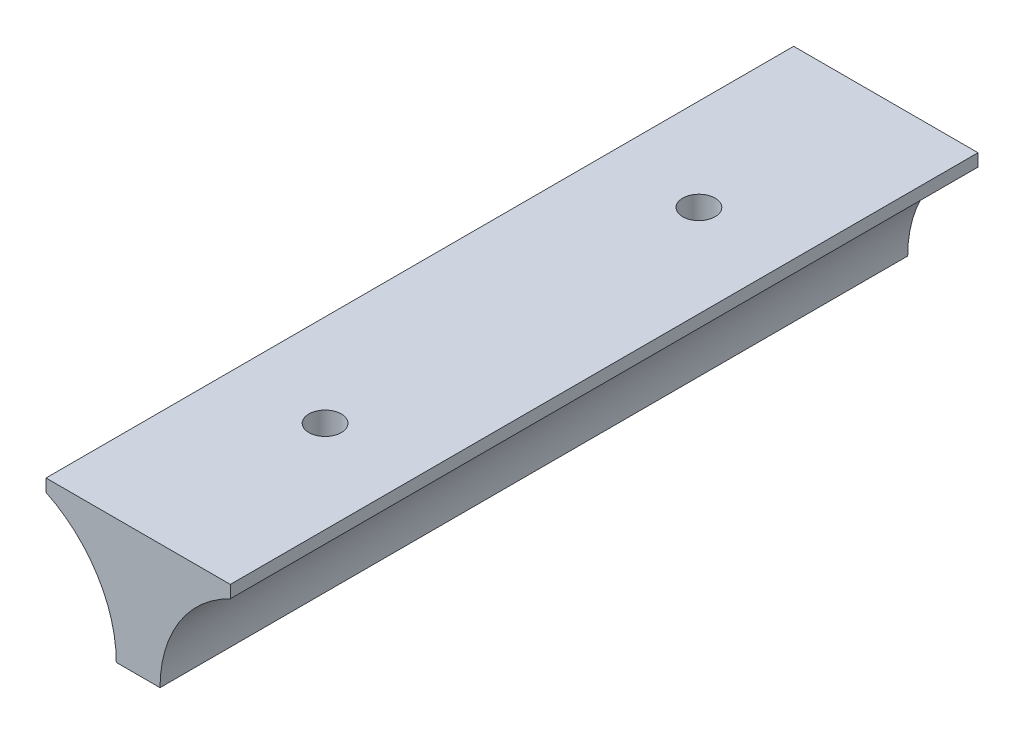
ISO-10303-21;
HEADER;
FILE_DESCRIPTION(('STEP AP214'),'2;1');
FILE_NAME('part.step','',(''),(''),'','','');
FILE_SCHEMA(('AUTOMOTIVE_DESIGN { 1 0 10303 214 1 1 1 1 }'));
ENDSEC;
DATA;
#1=APPLICATION_CONTEXT('core data for automotive mechanical design processes');
#2=APPLICATION_PROTOCOL_DEFINITION('international standard','automotive_design',2000,#1);
#3=PRODUCT_CONTEXT('',#1,'mechanical');
#4=PRODUCT('Part','Part','',(#3));
#5=PRODUCT_RELATED_PRODUCT_CATEGORY('part','',(#4));
#6=PRODUCT_DEFINITION_FORMATION('','',#4);
#7=PRODUCT_DEFINITION_CONTEXT('part definition',#1,'design');
#8=PRODUCT_DEFINITION('design','',#6,#7);
#9=PRODUCT_DEFINITION_SHAPE('','',#8);
#10=(LENGTH_UNIT() NAMED_UNIT(*) SI_UNIT(.MILLI.,.METRE.));
#11=(NAMED_UNIT(*) PLANE_ANGLE_UNIT() SI_UNIT($,.RADIAN.));
#12=(NAMED_UNIT(*) SI_UNIT($,.STERADIAN.) SOLID_ANGLE_UNIT());
#13=UNCERTAINTY_MEASURE_WITH_UNIT(LENGTH_MEASURE(1.E-05),#10,'distance_accuracy_value','');
#14=(GEOMETRIC_REPRESENTATION_CONTEXT(3) GLOBAL_UNCERTAINTY_ASSIGNED_CONTEXT((#13)) GLOBAL_UNIT_ASSIGNED_CONTEXT((#10,
#11,#12)) REPRESENTATION_CONTEXT('',''));
#15=CARTESIAN_POINT('',(0.,0.,0.));
#16=DIRECTION('',(0.,0.,1.));
#17=DIRECTION('',(1.,0.,0.));
#18=AXIS2_PLACEMENT_3D('',#15,#16,#17);
#19=CARTESIAN_POINT('',(-11.7545,0.,60.));
#20=DIRECTION('',(0.,0.,-1.));
#21=DIRECTION('',(-1.,0.,0.));
#22=AXIS2_PLACEMENT_3D('',#19,#20,#21);
#23=CYLINDRICAL_SURFACE('',#22,10.);
#24=CARTESIAN_POINT('',(-11.7545,0.,0.));
#25=DIRECTION('',(0.,0.,-1.));
#26=DIRECTION('',(1.,0.,0.));
#27=AXIS2_PLACEMENT_3D('',#24,#25,#26);
#28=CIRCLE('',#27,10.);
#29=CARTESIAN_POINT('',(-7.39560105645933,9.,0.));
#30=VERTEX_POINT('',#29);
#31=CARTESIAN_POINT('',(-1.7545,0.,0.));
#32=VERTEX_POINT('',#31);
#33=EDGE_CURVE('E121',#30,#32,#28,.T.);
#34=ORIENTED_EDGE('',*,*,#33,.T.);
#35=DIRECTION('',(0.,0.,-1.));
#36=VECTOR('',#35,1.);
#37=CARTESIAN_POINT('',(-1.7545,0.,60.));
#38=LINE('',#37,#36);
#39=CARTESIAN_POINT('',(-1.7545,0.,60.));
#40=VERTEX_POINT('',#39);
#41=EDGE_CURVE('E11',#40,#32,#38,.T.);
#42=ORIENTED_EDGE('',*,*,#41,.F.);
#43=CARTESIAN_POINT('',(-11.7545,0.,60.));
#44=DIRECTION('',(0.,0.,-1.));
#45=DIRECTION('',(1.,0.,0.));
#46=AXIS2_PLACEMENT_3D('',#43,#44,#45);
#47=CIRCLE('',#46,10.);
#48=CARTESIAN_POINT('',(-7.39560105645933,9.,60.));
#49=VERTEX_POINT('',#48);
#50=EDGE_CURVE('E132',#49,#40,#47,.T.);
#51=ORIENTED_EDGE('',*,*,#50,.F.);
#52=DIRECTION('',(0.,0.,-1.));
#53=VECTOR('',#52,1.);
#54=CARTESIAN_POINT('',(-7.39560105645933,9.,60.));
#55=LINE('',#54,#53);
#56=EDGE_CURVE('E117',#49,#30,#55,.T.);
#57=ORIENTED_EDGE('',*,*,#56,.T.);
#58=EDGE_LOOP('',(#34,#42,#51,#57));
#59=FACE_BOUND('',#58,.T.);
#60=ADVANCED_FACE('F37',(#59),#23,.F.);
#61=CARTESIAN_POINT('',(-1.7545,0.,60.));
#62=DIRECTION('',(0.,1.,0.));
#63=DIRECTION('',(-1.,0.,0.));
#64=AXIS2_PLACEMENT_3D('',#61,#62,#63);
#65=PLANE('',#64);
#66=CARTESIAN_POINT('',(0.,0.,45.));
#67=DIRECTION('',(0.,1.,0.));
#68=DIRECTION('',(-1.,0.,0.));
#69=AXIS2_PLACEMENT_3D('',#66,#67,#68);
#70=CIRCLE('',#69,1.3);
#71=CARTESIAN_POINT('',(-1.3,0.,45.));
#72=VERTEX_POINT('',#71);
#73=EDGE_CURVE('E223',#72,#72,#70,.T.);
#74=ORIENTED_EDGE('',*,*,#73,.T.);
#75=EDGE_LOOP('',(#74));
#76=FACE_BOUND('',#75,.T.);
#77=CARTESIAN_POINT('',(0.,0.,15.));
#78=DIRECTION('',(0.,1.,0.));
#79=DIRECTION('',(-1.,0.,0.));
#80=AXIS2_PLACEMENT_3D('',#77,#78,#79);
#81=CIRCLE('',#80,1.3);
#82=CARTESIAN_POINT('',(-1.3,0.,15.));
#83=VERTEX_POINT('',#82);
#84=EDGE_CURVE('E125',#83,#83,#81,.T.);
#85=ORIENTED_EDGE('',*,*,#84,.T.);
#86=EDGE_LOOP('',(#85));
#87=FACE_BOUND('',#86,.T.);
#88=DIRECTION('',(1.,0.,0.));
#89=VECTOR('',#88,1.);
#90=CARTESIAN_POINT('',(-1.7545,0.,0.));
#91=LINE('',#90,#89);
#92=CARTESIAN_POINT('',(1.7545,0.,0.));
#93=VERTEX_POINT('',#92);
#94=EDGE_CURVE('E124',#32,#93,#91,.T.);
#95=ORIENTED_EDGE('',*,*,#94,.T.);
#96=DIRECTION('',(0.,0.,-1.));
#97=VECTOR('',#96,1.);
#98=CARTESIAN_POINT('',(1.7545,0.,60.));
#99=LINE('',#98,#97);
#100=CARTESIAN_POINT('',(1.7545,0.,60.));
#101=VERTEX_POINT('',#100);
#102=EDGE_CURVE('E45',#101,#93,#99,.T.);
#103=ORIENTED_EDGE('',*,*,#102,.F.);
#104=DIRECTION('',(1.,0.,0.));
#105=VECTOR('',#104,1.);
#106=CARTESIAN_POINT('',(-1.7545,0.,60.));
#107=LINE('',#106,#105);
#108=EDGE_CURVE('E90',#40,#101,#107,.T.);
#109=ORIENTED_EDGE('',*,*,#108,.F.);
#110=ORIENTED_EDGE('',*,*,#41,.T.);
#111=EDGE_LOOP('',(#95,#103,#109,#110));
#112=FACE_BOUND('',#111,.T.);
#113=ADVANCED_FACE('F157',(#76,#87,#112),#65,.F.);
#114=CARTESIAN_POINT('',(11.7545,0.,60.));
#115=DIRECTION('',(0.,0.,-1.));
#116=DIRECTION('',(-1.,0.,0.));
#117=AXIS2_PLACEMENT_3D('',#114,#115,#116);
#118=CYLINDRICAL_SURFACE('',#117,10.);
#119=CARTESIAN_POINT('',(11.7545,0.,0.));
#120=DIRECTION('',(0.,0.,-1.));
#121=DIRECTION('',(-1.,0.,0.));
#122=AXIS2_PLACEMENT_3D('',#119,#120,#121);
#123=CIRCLE('',#122,10.);
#124=CARTESIAN_POINT('',(7.39560105645933,9.,0.));
#125=VERTEX_POINT('',#124);
#126=EDGE_CURVE('E127',#93,#125,#123,.T.);
#127=ORIENTED_EDGE('',*,*,#126,.T.);
#128=DIRECTION('',(0.,0.,-1.));
#129=VECTOR('',#128,1.);
#130=CARTESIAN_POINT('',(7.39560105645933,9.,60.));
#131=LINE('',#130,#129);
#132=CARTESIAN_POINT('',(7.39560105645933,9.,60.));
#133=VERTEX_POINT('',#132);
#134=EDGE_CURVE('E112',#133,#125,#131,.T.);
#135=ORIENTED_EDGE('',*,*,#134,.F.);
#136=CARTESIAN_POINT('',(11.7545,0.,60.));
#137=DIRECTION('',(0.,0.,-1.));
#138=DIRECTION('',(-1.,0.,0.));
#139=AXIS2_PLACEMENT_3D('',#136,#137,#138);
#140=CIRCLE('',#139,10.);
#141=EDGE_CURVE('E103',#101,#133,#140,.T.);
#142=ORIENTED_EDGE('',*,*,#141,.F.);
#143=ORIENTED_EDGE('',*,*,#102,.T.);
#144=EDGE_LOOP('',(#127,#135,#142,#143));
#145=FACE_BOUND('',#144,.T.);
#146=ADVANCED_FACE('F138',(#145),#118,.F.);
#147=CARTESIAN_POINT('',(7.39560105645933,9.,60.));
#148=DIRECTION('',(-1.,0.,0.));
#149=DIRECTION('',(0.,0.,1.));
#150=AXIS2_PLACEMENT_3D('',#147,#148,#149);
#151=PLANE('',#150);
#152=DIRECTION('',(0.,1.,0.));
#153=VECTOR('',#152,1.);
#154=CARTESIAN_POINT('',(7.39560105645933,9.,0.));
#155=LINE('',#154,#153);
#156=CARTESIAN_POINT('',(7.39560105645933,10.,0.));
#157=VERTEX_POINT('',#156);
#158=EDGE_CURVE('E111',#125,#157,#155,.T.);
#159=ORIENTED_EDGE('',*,*,#158,.T.);
#160=DIRECTION('',(0.,0.,-1.));
#161=VECTOR('',#160,1.);
#162=CARTESIAN_POINT('',(7.39560105645933,10.,60.));
#163=LINE('',#162,#161);
#164=CARTESIAN_POINT('',(7.39560105645933,10.,60.));
#165=VERTEX_POINT('',#164);
#166=EDGE_CURVE('E108',#165,#157,#163,.T.);
#167=ORIENTED_EDGE('',*,*,#166,.F.);
#168=DIRECTION('',(0.,1.,0.));
#169=VECTOR('',#168,1.);
#170=CARTESIAN_POINT('',(7.39560105645933,9.,60.));
#171=LINE('',#170,#169);
#172=EDGE_CURVE('E97',#133,#165,#171,.T.);
#173=ORIENTED_EDGE('',*,*,#172,.F.);
#174=ORIENTED_EDGE('',*,*,#134,.T.);
#175=EDGE_LOOP('',(#159,#167,#173,#174));
#176=FACE_BOUND('',#175,.T.);
#177=ADVANCED_FACE('F109',(#176),#151,.F.);
#178=CARTESIAN_POINT('',(7.39560105645933,10.,60.));
#179=DIRECTION('',(0.,-1.,0.));
#180=DIRECTION('',(0.,0.,-1.));
#181=AXIS2_PLACEMENT_3D('',#178,#179,#180);
#182=PLANE('',#181);
#183=CARTESIAN_POINT('',(0.,10.,45.));
#184=DIRECTION('',(0.,1.,0.));
#185=DIRECTION('',(0.,0.,1.));
#186=AXIS2_PLACEMENT_3D('',#183,#184,#185);
#187=CIRCLE('',#186,1.3);
#188=CARTESIAN_POINT('',(0.,10.,46.3));
#189=VERTEX_POINT('',#188);
#190=EDGE_CURVE('E226',#189,#189,#187,.T.);
#191=ORIENTED_EDGE('',*,*,#190,.F.);
#192=EDGE_LOOP('',(#191));
#193=FACE_BOUND('',#192,.T.);
#194=CARTESIAN_POINT('',(0.,10.,15.));
#195=DIRECTION('',(0.,1.,0.));
#196=DIRECTION('',(0.,0.,1.));
#197=AXIS2_PLACEMENT_3D('',#194,#195,#196);
#198=CIRCLE('',#197,1.3);
#199=CARTESIAN_POINT('',(0.,10.,16.3));
#200=VERTEX_POINT('',#199);
#201=EDGE_CURVE('E228',#200,#200,#198,.T.);
#202=ORIENTED_EDGE('',*,*,#201,.F.);
#203=EDGE_LOOP('',(#202));
#204=FACE_BOUND('',#203,.T.);
#205=DIRECTION('',(-1.,0.,0.));
#206=VECTOR('',#205,1.);
#207=CARTESIAN_POINT('',(7.39560105645933,10.,0.));
#208=LINE('',#207,#206);
#209=CARTESIAN_POINT('',(-7.39560105645933,10.,0.));
#210=VERTEX_POINT('',#209);
#211=EDGE_CURVE('E76',#157,#210,#208,.T.);
#212=ORIENTED_EDGE('',*,*,#211,.T.);
#213=DIRECTION('',(0.,0.,-1.));
#214=VECTOR('',#213,1.);
#215=CARTESIAN_POINT('',(-7.39560105645933,10.,60.));
#216=LINE('',#215,#214);
#217=CARTESIAN_POINT('',(-7.39560105645933,10.,60.));
#218=VERTEX_POINT('',#217);
#219=EDGE_CURVE('E113',#218,#210,#216,.T.);
#220=ORIENTED_EDGE('',*,*,#219,.F.);
#221=DIRECTION('',(-1.,0.,0.));
#222=VECTOR('',#221,1.);
#223=CARTESIAN_POINT('',(7.39560105645933,10.,60.));
#224=LINE('',#223,#222);
#225=EDGE_CURVE('E101',#165,#218,#224,.T.);
#226=ORIENTED_EDGE('',*,*,#225,.F.);
#227=ORIENTED_EDGE('',*,*,#166,.T.);
#228=EDGE_LOOP('',(#212,#220,#226,#227));
#229=FACE_BOUND('',#228,.T.);
#230=ADVANCED_FACE('F115',(#193,#204,#229),#182,.F.);
#231=CARTESIAN_POINT('',(-7.39560105645933,10.,60.));
#232=DIRECTION('',(1.,0.,0.));
#233=DIRECTION('',(0.,0.,-1.));
#234=AXIS2_PLACEMENT_3D('',#231,#232,#233);
#235=PLANE('',#234);
#236=DIRECTION('',(0.,-1.,0.));
#237=VECTOR('',#236,1.);
#238=CARTESIAN_POINT('',(-7.39560105645933,10.,0.));
#239=LINE('',#238,#237);
#240=EDGE_CURVE('E82',#210,#30,#239,.T.);
#241=ORIENTED_EDGE('',*,*,#240,.T.);
#242=ORIENTED_EDGE('',*,*,#56,.F.);
#243=DIRECTION('',(0.,-1.,0.));
#244=VECTOR('',#243,1.);
#245=CARTESIAN_POINT('',(-7.39560105645933,10.,60.));
#246=LINE('',#245,#244);
#247=EDGE_CURVE('E53',#218,#49,#246,.T.);
#248=ORIENTED_EDGE('',*,*,#247,.F.);
#249=ORIENTED_EDGE('',*,*,#219,.T.);
#250=EDGE_LOOP('',(#241,#242,#248,#249));
#251=FACE_BOUND('',#250,.T.);
#252=ADVANCED_FACE('F145',(#251),#235,.F.);
#253=CARTESIAN_POINT('',(-11.7545,0.,60.));
#254=DIRECTION('',(0.,0.,1.));
#255=DIRECTION('',(1.,0.,0.));
#256=AXIS2_PLACEMENT_3D('',#253,#254,#255);
#257=PLANE('',#256);
#258=ORIENTED_EDGE('',*,*,#50,.T.);
#259=ORIENTED_EDGE('',*,*,#108,.T.);
#260=ORIENTED_EDGE('',*,*,#141,.T.);
#261=ORIENTED_EDGE('',*,*,#172,.T.);
#262=ORIENTED_EDGE('',*,*,#225,.T.);
#263=ORIENTED_EDGE('',*,*,#247,.T.);
#264=EDGE_LOOP('',(#258,#259,#260,#261,#262,#263));
#265=FACE_BOUND('',#264,.T.);
#266=ADVANCED_FACE('F99',(#265),#257,.T.);
#267=CARTESIAN_POINT('',(-11.7545,0.,0.));
#268=DIRECTION('',(0.,0.,1.));
#269=DIRECTION('',(1.,0.,0.));
#270=AXIS2_PLACEMENT_3D('',#267,#268,#269);
#271=PLANE('',#270);
#272=ORIENTED_EDGE('',*,*,#33,.F.);
#273=ORIENTED_EDGE('',*,*,#240,.F.);
#274=ORIENTED_EDGE('',*,*,#211,.F.);
#275=ORIENTED_EDGE('',*,*,#158,.F.);
#276=ORIENTED_EDGE('',*,*,#126,.F.);
#277=ORIENTED_EDGE('',*,*,#94,.F.);
#278=EDGE_LOOP('',(#272,#273,#274,#275,#276,#277));
#279=FACE_BOUND('',#278,.T.);
#280=ADVANCED_FACE('F141',(#279),#271,.F.);
#281=CARTESIAN_POINT('',(0.,10.,15.));
#282=DIRECTION('',(0.,1.,0.));
#283=DIRECTION('',(0.,0.,1.));
#284=AXIS2_PLACEMENT_3D('',#281,#282,#283);
#285=CYLINDRICAL_SURFACE('',#284,1.3);
#286=ORIENTED_EDGE('',*,*,#84,.F.);
#287=EDGE_LOOP('',(#286));
#288=FACE_BOUND('',#287,.T.);
#289=ORIENTED_EDGE('',*,*,#201,.T.);
#290=EDGE_LOOP('',(#289));
#291=FACE_BOUND('',#290,.T.);
#292=ADVANCED_FACE('F187',(#288,#291),#285,.F.);
#293=CARTESIAN_POINT('',(0.,10.,45.));
#294=DIRECTION('',(0.,1.,0.));
#295=DIRECTION('',(0.,0.,1.));
#296=AXIS2_PLACEMENT_3D('',#293,#294,#295);
#297=CYLINDRICAL_SURFACE('',#296,1.3);
#298=ORIENTED_EDGE('',*,*,#73,.F.);
#299=EDGE_LOOP('',(#298));
#300=FACE_BOUND('',#299,.T.);
#301=ORIENTED_EDGE('',*,*,#190,.T.);
#302=EDGE_LOOP('',(#301));
#303=FACE_BOUND('',#302,.T.);
#304=ADVANCED_FACE('F192',(#300,#303),#297,.F.);
#305=CLOSED_SHELL('',(#60,#113,#146,#177,#230,#252,#266,#280,#292,#304));
#306=MANIFOLD_SOLID_BREP('B2',#305);
#307=ADVANCED_BREP_SHAPE_REPRESENTATION('',(#18,#306),#14);
#308=SHAPE_DEFINITION_REPRESENTATION(#9,#307);
ENDSEC;
END-ISO-10303-21;
